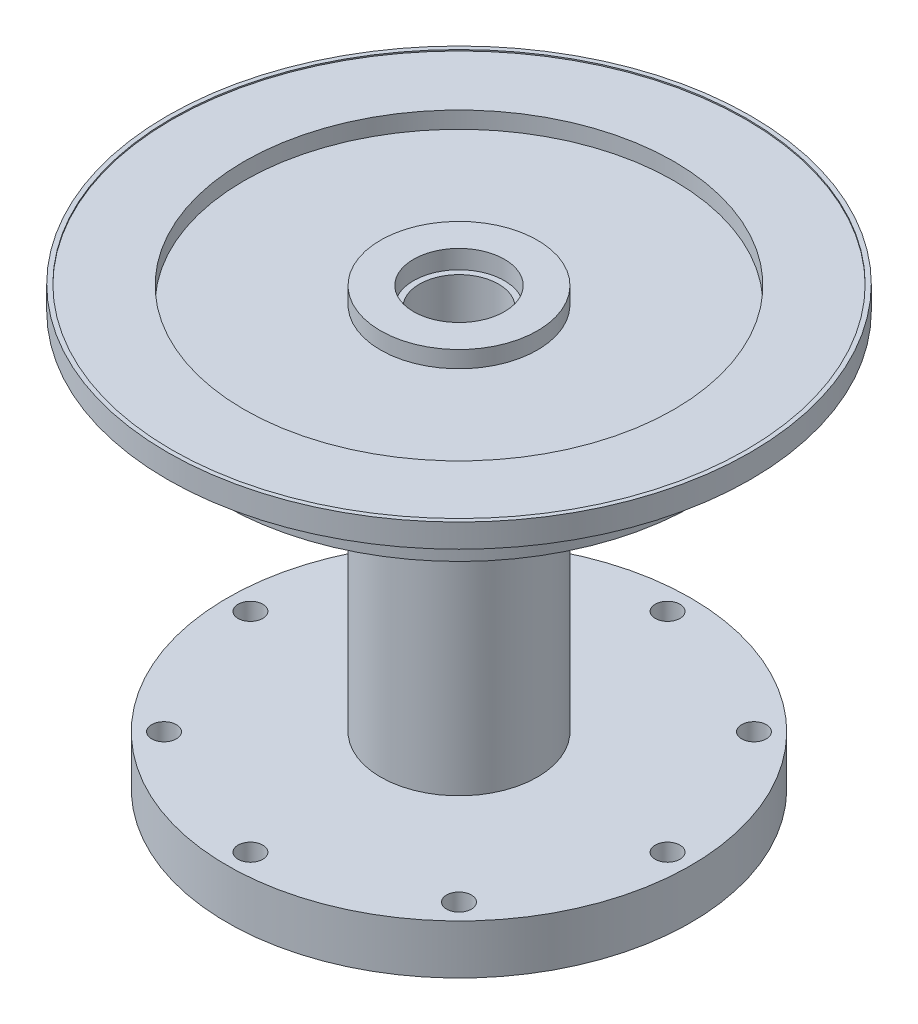
ISO-10303-21;
HEADER;
FILE_DESCRIPTION(('STEP AP214'),'2;1');
FILE_NAME('part.step','',(''),(''),'','','');
FILE_SCHEMA(('AUTOMOTIVE_DESIGN { 1 0 10303 214 1 1 1 1 }'));
ENDSEC;
DATA;
#1=APPLICATION_CONTEXT('core data for automotive mechanical design processes');
#2=APPLICATION_PROTOCOL_DEFINITION('international standard','automotive_design',2000,#1);
#3=PRODUCT_CONTEXT('',#1,'mechanical');
#4=PRODUCT('Part','Part','',(#3));
#5=PRODUCT_RELATED_PRODUCT_CATEGORY('part','',(#4));
#6=PRODUCT_DEFINITION_FORMATION('','',#4);
#7=PRODUCT_DEFINITION_CONTEXT('part definition',#1,'design');
#8=PRODUCT_DEFINITION('design','',#6,#7);
#9=PRODUCT_DEFINITION_SHAPE('','',#8);
#10=(LENGTH_UNIT() NAMED_UNIT(*) SI_UNIT(.MILLI.,.METRE.));
#11=(NAMED_UNIT(*) PLANE_ANGLE_UNIT() SI_UNIT($,.RADIAN.));
#12=(NAMED_UNIT(*) SI_UNIT($,.STERADIAN.) SOLID_ANGLE_UNIT());
#13=UNCERTAINTY_MEASURE_WITH_UNIT(LENGTH_MEASURE(1.E-05),#10,'distance_accuracy_value','');
#14=(GEOMETRIC_REPRESENTATION_CONTEXT(3) GLOBAL_UNCERTAINTY_ASSIGNED_CONTEXT((#13)) GLOBAL_UNIT_ASSIGNED_CONTEXT((#10,
#11,#12)) REPRESENTATION_CONTEXT('',''));
#15=CARTESIAN_POINT('',(0.,0.,0.));
#16=DIRECTION('',(0.,0.,1.));
#17=DIRECTION('',(1.,0.,0.));
#18=AXIS2_PLACEMENT_3D('',#15,#16,#17);
#19=CARTESIAN_POINT('',(0.,-58.8,0.));
#20=DIRECTION('',(0.,-1.,0.));
#21=DIRECTION('',(0.,0.,-1.));
#22=AXIS2_PLACEMENT_3D('',#19,#20,#21);
#23=PLANE('',#22);
#24=CARTESIAN_POINT('',(0.,-58.8,0.));
#25=DIRECTION('',(0.,-1.,0.));
#26=DIRECTION('',(0.,0.,-1.));
#27=AXIS2_PLACEMENT_3D('',#24,#25,#26);
#28=CIRCLE('',#27,5.35);
#29=CARTESIAN_POINT('',(0.,-58.8,-5.35));
#30=VERTEX_POINT('',#29);
#31=EDGE_CURVE('E141',#30,#30,#28,.T.);
#32=ORIENTED_EDGE('',*,*,#31,.F.);
#33=EDGE_LOOP('',(#32));
#34=FACE_BOUND('',#33,.T.);
#35=CARTESIAN_POINT('',(0.,-58.8,0.));
#36=DIRECTION('',(0.,-1.,0.));
#37=DIRECTION('',(0.,0.,-1.));
#38=AXIS2_PLACEMENT_3D('',#35,#36,#37);
#39=CIRCLE('',#38,19.21);
#40=CARTESIAN_POINT('',(0.,-58.8,-19.21));
#41=VERTEX_POINT('',#40);
#42=EDGE_CURVE('E151',#41,#41,#39,.T.);
#43=ORIENTED_EDGE('',*,*,#42,.T.);
#44=EDGE_LOOP('',(#43));
#45=FACE_BOUND('',#44,.T.);
#46=ADVANCED_FACE('F31',(#34,#45),#23,.T.);
#47=CARTESIAN_POINT('',(0.,0.,0.));
#48=DIRECTION('',(0.,1.,0.));
#49=DIRECTION('',(0.,0.,1.));
#50=AXIS2_PLACEMENT_3D('',#47,#48,#49);
#51=PLANE('',#50);
#52=CARTESIAN_POINT('',(0.,0.,0.));
#53=DIRECTION('',(0.,1.,0.));
#54=DIRECTION('',(0.,0.,1.));
#55=AXIS2_PLACEMENT_3D('',#52,#53,#54);
#56=CIRCLE('',#55,38.1);
#57=CARTESIAN_POINT('',(0.,0.,38.1));
#58=VERTEX_POINT('',#57);
#59=EDGE_CURVE('E43',#58,#58,#56,.T.);
#60=ORIENTED_EDGE('',*,*,#59,.F.);
#61=EDGE_LOOP('',(#60));
#62=FACE_BOUND('',#61,.T.);
#63=CARTESIAN_POINT('',(0.,0.,0.));
#64=DIRECTION('',(0.,1.,0.));
#65=DIRECTION('',(0.,0.,1.));
#66=AXIS2_PLACEMENT_3D('',#63,#64,#65);
#67=CIRCLE('',#66,12.7);
#68=CARTESIAN_POINT('',(0.,0.,12.7));
#69=VERTEX_POINT('',#68);
#70=EDGE_CURVE('E10',#69,#69,#67,.F.);
#71=ORIENTED_EDGE('',*,*,#70,.F.);
#72=EDGE_LOOP('',(#71));
#73=FACE_BOUND('',#72,.T.);
#74=ADVANCED_FACE('F228',(#62,#73),#51,.F.);
#75=CARTESIAN_POINT('',(0.,4.826,0.));
#76=DIRECTION('',(0.,-1.,0.));
#77=DIRECTION('',(0.,0.,-1.));
#78=AXIS2_PLACEMENT_3D('',#75,#76,#77);
#79=CYLINDRICAL_SURFACE('',#78,38.1);
#80=CARTESIAN_POINT('',(0.,4.826,0.));
#81=DIRECTION('',(0.,1.,0.));
#82=DIRECTION('',(0.,0.,1.));
#83=AXIS2_PLACEMENT_3D('',#80,#81,#82);
#84=CIRCLE('',#83,38.1);
#85=CARTESIAN_POINT('',(0.,4.826,38.1));
#86=VERTEX_POINT('',#85);
#87=EDGE_CURVE('E39',#86,#86,#84,.T.);
#88=ORIENTED_EDGE('',*,*,#87,.F.);
#89=EDGE_LOOP('',(#88));
#90=FACE_BOUND('',#89,.T.);
#91=ORIENTED_EDGE('',*,*,#59,.T.);
#92=EDGE_LOOP('',(#91));
#93=FACE_BOUND('',#92,.T.);
#94=ADVANCED_FACE('F33',(#90,#93),#79,.T.);
#95=CARTESIAN_POINT('',(0.,4.826,0.));
#96=DIRECTION('',(0.,1.,0.));
#97=DIRECTION('',(0.,0.,1.));
#98=AXIS2_PLACEMENT_3D('',#95,#96,#97);
#99=CONICAL_SURFACE('',#98,38.1,1.22173047639603);
#100=CARTESIAN_POINT('',(0.,8.128,0.));
#101=DIRECTION('',(0.,1.,0.));
#102=DIRECTION('',(0.,0.,1.));
#103=AXIS2_PLACEMENT_3D('',#100,#101,#102);
#104=CIRCLE('',#103,47.1721704390392);
#105=CARTESIAN_POINT('',(0.,8.128,-47.1721704390392));
#106=VERTEX_POINT('',#105);
#107=EDGE_CURVE('E47',#106,#106,#104,.T.);
#108=ORIENTED_EDGE('',*,*,#107,.F.);
#109=EDGE_LOOP('',(#108));
#110=FACE_BOUND('',#109,.T.);
#111=ORIENTED_EDGE('',*,*,#87,.T.);
#112=EDGE_LOOP('',(#111));
#113=FACE_BOUND('',#112,.T.);
#114=ADVANCED_FACE('F282',(#110,#113),#99,.T.);
#115=CARTESIAN_POINT('',(0.,11.938,0.));
#116=DIRECTION('',(0.,-1.,0.));
#117=DIRECTION('',(0.,0.,-1.));
#118=AXIS2_PLACEMENT_3D('',#115,#116,#117);
#119=CYLINDRICAL_SURFACE('',#118,47.1721704390392);
#120=CARTESIAN_POINT('',(0.,11.938,0.));
#121=DIRECTION('',(0.,1.,0.));
#122=DIRECTION('',(0.,0.,1.));
#123=AXIS2_PLACEMENT_3D('',#120,#121,#122);
#124=CIRCLE('',#123,47.1721704390392);
#125=CARTESIAN_POINT('',(0.,11.938,-47.1721704390392));
#126=VERTEX_POINT('',#125);
#127=EDGE_CURVE('E51',#126,#126,#124,.T.);
#128=CARTESIAN_POINT('',(0.,11.938,-47.1721704390392));
#129=CARTESIAN_POINT('',(0.,11.8983125,-47.1721704390392));
#130=CARTESIAN_POINT('',(0.,11.858625,-47.1721704390392));
#131=CARTESIAN_POINT('',(0.,11.77925,-47.1721704390392));
#132=CARTESIAN_POINT('',(0.,11.7395625,-47.1721704390392));
#133=CARTESIAN_POINT('',(0.,11.6601875,-47.1721704390392));
#134=CARTESIAN_POINT('',(0.,11.6205,-47.1721704390392));
#135=CARTESIAN_POINT('',(0.,11.541125,-47.1721704390392));
#136=CARTESIAN_POINT('',(0.,11.5014375,-47.1721704390392));
#137=CARTESIAN_POINT('',(0.,11.4220625,-47.1721704390392));
#138=CARTESIAN_POINT('',(0.,11.382375,-47.1721704390392));
#139=CARTESIAN_POINT('',(0.,11.303,-47.1721704390392));
#140=CARTESIAN_POINT('',(0.,11.2633125,-47.1721704390392));
#141=CARTESIAN_POINT('',(0.,11.1839375,-47.1721704390392));
#142=CARTESIAN_POINT('',(0.,11.14425,-47.1721704390392));
#143=CARTESIAN_POINT('',(0.,11.064875,-47.1721704390392));
#144=CARTESIAN_POINT('',(0.,11.0251875,-47.1721704390392));
#145=CARTESIAN_POINT('',(0.,10.9458125,-47.1721704390392));
#146=CARTESIAN_POINT('',(0.,10.906125,-47.1721704390392));
#147=CARTESIAN_POINT('',(0.,10.82675,-47.1721704390392));
#148=CARTESIAN_POINT('',(0.,10.7870625,-47.1721704390392));
#149=CARTESIAN_POINT('',(0.,10.7076875,-47.1721704390392));
#150=CARTESIAN_POINT('',(0.,10.668,-47.1721704390392));
#151=CARTESIAN_POINT('',(0.,10.588625,-47.1721704390392));
#152=CARTESIAN_POINT('',(0.,10.5489375,-47.1721704390392));
#153=CARTESIAN_POINT('',(0.,10.4695625,-47.1721704390392));
#154=CARTESIAN_POINT('',(0.,10.429875,-47.1721704390392));
#155=CARTESIAN_POINT('',(0.,10.3505,-47.1721704390392));
#156=CARTESIAN_POINT('',(0.,10.3108125,-47.1721704390392));
#157=CARTESIAN_POINT('',(0.,10.2314375,-47.1721704390392));
#158=CARTESIAN_POINT('',(0.,10.19175,-47.1721704390392));
#159=CARTESIAN_POINT('',(0.,10.112375,-47.1721704390392));
#160=CARTESIAN_POINT('',(0.,10.0726875,-47.1721704390392));
#161=CARTESIAN_POINT('',(0.,9.9933125,-47.1721704390392));
#162=CARTESIAN_POINT('',(0.,9.953625,-47.1721704390392));
#163=CARTESIAN_POINT('',(0.,9.87425,-47.1721704390392));
#164=CARTESIAN_POINT('',(0.,9.8345625,-47.1721704390392));
#165=CARTESIAN_POINT('',(0.,9.7551875,-47.1721704390392));
#166=CARTESIAN_POINT('',(0.,9.7155,-47.1721704390392));
#167=CARTESIAN_POINT('',(0.,9.636125,-47.1721704390392));
#168=CARTESIAN_POINT('',(0.,9.5964375,-47.1721704390392));
#169=CARTESIAN_POINT('',(0.,9.5170625,-47.1721704390392));
#170=CARTESIAN_POINT('',(0.,9.477375,-47.1721704390392));
#171=CARTESIAN_POINT('',(0.,9.398,-47.1721704390392));
#172=CARTESIAN_POINT('',(0.,9.3583125,-47.1721704390392));
#173=CARTESIAN_POINT('',(0.,9.2789375,-47.1721704390392));
#174=CARTESIAN_POINT('',(0.,9.23925,-47.1721704390392));
#175=CARTESIAN_POINT('',(0.,9.159875,-47.1721704390392));
#176=CARTESIAN_POINT('',(0.,9.1201875,-47.1721704390392));
#177=CARTESIAN_POINT('',(0.,9.0408125,-47.1721704390392));
#178=CARTESIAN_POINT('',(0.,9.001125,-47.1721704390392));
#179=CARTESIAN_POINT('',(0.,8.92175,-47.1721704390392));
#180=CARTESIAN_POINT('',(0.,8.8820625,-47.1721704390392));
#181=CARTESIAN_POINT('',(0.,8.8026875,-47.1721704390392));
#182=CARTESIAN_POINT('',(0.,8.763,-47.1721704390392));
#183=CARTESIAN_POINT('',(0.,8.683625,-47.1721704390392));
#184=CARTESIAN_POINT('',(0.,8.6439375,-47.1721704390392));
#185=CARTESIAN_POINT('',(0.,8.5645625,-47.1721704390392));
#186=CARTESIAN_POINT('',(0.,8.524875,-47.1721704390392));
#187=CARTESIAN_POINT('',(0.,8.4455,-47.1721704390392));
#188=CARTESIAN_POINT('',(0.,8.4058125,-47.1721704390392));
#189=CARTESIAN_POINT('',(0.,8.3264375,-47.1721704390392));
#190=CARTESIAN_POINT('',(0.,8.28675,-47.1721704390392));
#191=CARTESIAN_POINT('',(0.,8.207375,-47.1721704390392));
#192=CARTESIAN_POINT('',(0.,8.1676875,-47.1721704390392));
#193=CARTESIAN_POINT('',(0.,8.128,-47.1721704390392));
#194=B_SPLINE_CURVE_WITH_KNOTS('',3,(#128,#129,#130,#131,#132,#133,#134,#135,#136,#137,#138,
#139,#140,#141,#142,#143,#144,#145,#146,#147,#148,#149,#150,#151,#152,#153,#154,#155,#156,#157,
#158,#159,#160,#161,#162,#163,#164,#165,#166,#167,#168,#169,#170,#171,#172,#173,#174,#175,#176,
#177,#178,#179,#180,#181,#182,#183,#184,#185,#186,#187,#188,#189,#190,#191,#192,#193),
.UNSPECIFIED.,.F.,.F.,(4,2,2,2,2,2,2,2,2,2,2,2,2,2,2,2,2,2,2,2,2,2,2,2,2,2,2,2,2,2,2,2,4),(0.,
0.119062499999999,0.238124999999999,0.3571875,0.476249999999999,0.595312499999999,0.714375,
0.833437499999999,0.952499999999998,1.0715625,1.190625,1.3096875,1.42875,1.5478125,1.666875,
1.7859375,1.905,2.0240625,2.143125,2.2621875,2.38125,2.5003125,2.619375,2.7384375,2.8575,
2.9765625,3.095625,3.2146875,3.33375,3.4528125,3.571875,3.6909375,3.81),.UNSPECIFIED.);
#195=EDGE_CURVE('BSEAM278',#126,#106,#194,.T.);
#196=ORIENTED_EDGE('',*,*,#127,.F.);
#197=ORIENTED_EDGE('',*,*,#107,.T.);
#198=ORIENTED_EDGE('',*,*,#195,.T.);
#199=ORIENTED_EDGE('',*,*,#195,.F.);
#200=EDGE_LOOP('',(#196,#198,#197,#199));
#201=FACE_BOUND('',#200,.T.);
#202=ADVANCED_FACE('F278',(#201),#119,.T.);
#203=CARTESIAN_POINT('',(0.,11.938,0.));
#204=DIRECTION('',(0.,1.,0.));
#205=DIRECTION('',(0.,0.,1.));
#206=AXIS2_PLACEMENT_3D('',#203,#204,#205);
#207=PLANE('',#206);
#208=CARTESIAN_POINT('',(0.,11.938,0.));
#209=DIRECTION('',(0.,1.,0.));
#210=DIRECTION('',(0.,0.,1.));
#211=AXIS2_PLACEMENT_3D('',#208,#209,#210);
#212=CIRCLE('',#211,46.4721704390392);
#213=CARTESIAN_POINT('',(0.,11.938,46.4721704390392));
#214=VERTEX_POINT('',#213);
#215=EDGE_CURVE('E55',#214,#214,#212,.T.);
#216=ORIENTED_EDGE('',*,*,#215,.F.);
#217=EDGE_LOOP('',(#216));
#218=FACE_BOUND('',#217,.T.);
#219=ORIENTED_EDGE('',*,*,#127,.T.);
#220=EDGE_LOOP('',(#219));
#221=FACE_BOUND('',#220,.T.);
#222=ADVANCED_FACE('F274',(#218,#221),#207,.T.);
#223=CARTESIAN_POINT('',(0.,11.738,0.));
#224=DIRECTION('',(0.,1.,0.));
#225=DIRECTION('',(0.,0.,1.));
#226=AXIS2_PLACEMENT_3D('',#223,#224,#225);
#227=CYLINDRICAL_SURFACE('',#226,46.4721704390392);
#228=CARTESIAN_POINT('',(0.,11.738,0.));
#229=DIRECTION('',(0.,1.,0.));
#230=DIRECTION('',(0.,0.,1.));
#231=AXIS2_PLACEMENT_3D('',#228,#229,#230);
#232=CIRCLE('',#231,46.4721704390392);
#233=CARTESIAN_POINT('',(0.,11.738,46.4721704390392));
#234=VERTEX_POINT('',#233);
#235=EDGE_CURVE('E54',#234,#234,#232,.T.);
#236=ORIENTED_EDGE('',*,*,#235,.F.);
#237=EDGE_LOOP('',(#236));
#238=FACE_BOUND('',#237,.T.);
#239=ORIENTED_EDGE('',*,*,#215,.T.);
#240=EDGE_LOOP('',(#239));
#241=FACE_BOUND('',#240,.T.);
#242=ADVANCED_FACE('F270',(#238,#241),#227,.F.);
#243=CARTESIAN_POINT('',(0.,11.738,0.));
#244=DIRECTION('',(0.,1.,0.));
#245=DIRECTION('',(0.,0.,1.));
#246=AXIS2_PLACEMENT_3D('',#243,#244,#245);
#247=PLANE('',#246);
#248=CARTESIAN_POINT('',(0.,11.738,0.));
#249=DIRECTION('',(0.,1.,0.));
#250=DIRECTION('',(0.,0.,1.));
#251=AXIS2_PLACEMENT_3D('',#248,#249,#250);
#252=CIRCLE('',#251,34.7721704390392);
#253=CARTESIAN_POINT('',(0.,11.738,34.7721704390392));
#254=VERTEX_POINT('',#253);
#255=EDGE_CURVE('E61',#254,#254,#252,.T.);
#256=ORIENTED_EDGE('',*,*,#255,.F.);
#257=EDGE_LOOP('',(#256));
#258=FACE_BOUND('',#257,.T.);
#259=ORIENTED_EDGE('',*,*,#235,.T.);
#260=EDGE_LOOP('',(#259));
#261=FACE_BOUND('',#260,.T.);
#262=ADVANCED_FACE('F225',(#258,#261),#247,.T.);
#263=CARTESIAN_POINT('',(0.,9.038,0.));
#264=DIRECTION('',(0.,1.,0.));
#265=DIRECTION('',(0.,0.,1.));
#266=AXIS2_PLACEMENT_3D('',#263,#264,#265);
#267=CYLINDRICAL_SURFACE('',#266,34.7721704390392);
#268=CARTESIAN_POINT('',(0.,9.038,0.));
#269=DIRECTION('',(0.,1.,0.));
#270=DIRECTION('',(0.,0.,1.));
#271=AXIS2_PLACEMENT_3D('',#268,#269,#270);
#272=CIRCLE('',#271,34.7721704390392);
#273=CARTESIAN_POINT('',(0.,9.038,34.7721704390392));
#274=VERTEX_POINT('',#273);
#275=EDGE_CURVE('E58',#274,#274,#272,.T.);
#276=CARTESIAN_POINT('',(0.,9.038,34.7721704390392));
#277=CARTESIAN_POINT('',(0.,9.066125,34.7721704390392));
#278=CARTESIAN_POINT('',(0.,9.09425,34.7721704390392));
#279=CARTESIAN_POINT('',(0.,9.1505,34.7721704390392));
#280=CARTESIAN_POINT('',(0.,9.178625,34.7721704390392));
#281=CARTESIAN_POINT('',(0.,9.234875,34.7721704390392));
#282=CARTESIAN_POINT('',(0.,9.263,34.7721704390392));
#283=CARTESIAN_POINT('',(0.,9.31925,34.7721704390392));
#284=CARTESIAN_POINT('',(0.,9.347375,34.7721704390392));
#285=CARTESIAN_POINT('',(0.,9.403625,34.7721704390392));
#286=CARTESIAN_POINT('',(0.,9.43175,34.7721704390392));
#287=CARTESIAN_POINT('',(0.,9.488,34.7721704390392));
#288=CARTESIAN_POINT('',(0.,9.516125,34.7721704390392));
#289=CARTESIAN_POINT('',(0.,9.572375,34.7721704390392));
#290=CARTESIAN_POINT('',(0.,9.6005,34.7721704390392));
#291=CARTESIAN_POINT('',(0.,9.65675,34.7721704390392));
#292=CARTESIAN_POINT('',(0.,9.684875,34.7721704390392));
#293=CARTESIAN_POINT('',(0.,9.741125,34.7721704390392));
#294=CARTESIAN_POINT('',(0.,9.76925,34.7721704390392));
#295=CARTESIAN_POINT('',(0.,9.8255,34.7721704390392));
#296=CARTESIAN_POINT('',(0.,9.853625,34.7721704390392));
#297=CARTESIAN_POINT('',(0.,9.909875,34.7721704390392));
#298=CARTESIAN_POINT('',(0.,9.938,34.7721704390392));
#299=CARTESIAN_POINT('',(0.,9.99425,34.7721704390392));
#300=CARTESIAN_POINT('',(0.,10.022375,34.7721704390392));
#301=CARTESIAN_POINT('',(0.,10.078625,34.7721704390392));
#302=CARTESIAN_POINT('',(0.,10.10675,34.7721704390392));
#303=CARTESIAN_POINT('',(0.,10.163,34.7721704390392));
#304=CARTESIAN_POINT('',(0.,10.191125,34.7721704390392));
#305=CARTESIAN_POINT('',(0.,10.247375,34.7721704390392));
#306=CARTESIAN_POINT('',(0.,10.2755,34.7721704390392));
#307=CARTESIAN_POINT('',(0.,10.33175,34.7721704390392));
#308=CARTESIAN_POINT('',(0.,10.359875,34.7721704390392));
#309=CARTESIAN_POINT('',(0.,10.416125,34.7721704390392));
#310=CARTESIAN_POINT('',(0.,10.44425,34.7721704390392));
#311=CARTESIAN_POINT('',(0.,10.5005,34.7721704390392));
#312=CARTESIAN_POINT('',(0.,10.528625,34.7721704390392));
#313=CARTESIAN_POINT('',(0.,10.584875,34.7721704390392));
#314=CARTESIAN_POINT('',(0.,10.613,34.7721704390392));
#315=CARTESIAN_POINT('',(0.,10.66925,34.7721704390392));
#316=CARTESIAN_POINT('',(0.,10.697375,34.7721704390392));
#317=CARTESIAN_POINT('',(0.,10.753625,34.7721704390392));
#318=CARTESIAN_POINT('',(0.,10.78175,34.7721704390392));
#319=CARTESIAN_POINT('',(0.,10.838,34.7721704390392));
#320=CARTESIAN_POINT('',(0.,10.866125,34.7721704390392));
#321=CARTESIAN_POINT('',(0.,10.922375,34.7721704390392));
#322=CARTESIAN_POINT('',(0.,10.9505,34.7721704390392));
#323=CARTESIAN_POINT('',(0.,11.00675,34.7721704390392));
#324=CARTESIAN_POINT('',(0.,11.034875,34.7721704390392));
#325=CARTESIAN_POINT('',(0.,11.091125,34.7721704390392));
#326=CARTESIAN_POINT('',(0.,11.11925,34.7721704390392));
#327=CARTESIAN_POINT('',(0.,11.1755,34.7721704390392));
#328=CARTESIAN_POINT('',(0.,11.203625,34.7721704390392));
#329=CARTESIAN_POINT('',(0.,11.259875,34.7721704390392));
#330=CARTESIAN_POINT('',(0.,11.288,34.7721704390392));
#331=CARTESIAN_POINT('',(0.,11.34425,34.7721704390392));
#332=CARTESIAN_POINT('',(0.,11.372375,34.7721704390392));
#333=CARTESIAN_POINT('',(0.,11.428625,34.7721704390392));
#334=CARTESIAN_POINT('',(0.,11.45675,34.7721704390392));
#335=CARTESIAN_POINT('',(0.,11.513,34.7721704390392));
#336=CARTESIAN_POINT('',(0.,11.541125,34.7721704390392));
#337=CARTESIAN_POINT('',(0.,11.597375,34.7721704390392));
#338=CARTESIAN_POINT('',(0.,11.6255,34.7721704390392));
#339=CARTESIAN_POINT('',(0.,11.68175,34.7721704390392));
#340=CARTESIAN_POINT('',(0.,11.709875,34.7721704390392));
#341=CARTESIAN_POINT('',(0.,11.738,34.7721704390392));
#342=B_SPLINE_CURVE_WITH_KNOTS('',3,(#276,#277,#278,#279,#280,#281,#282,#283,#284,#285,#286,
#287,#288,#289,#290,#291,#292,#293,#294,#295,#296,#297,#298,#299,#300,#301,#302,#303,#304,#305,
#306,#307,#308,#309,#310,#311,#312,#313,#314,#315,#316,#317,#318,#319,#320,#321,#322,#323,#324,
#325,#326,#327,#328,#329,#330,#331,#332,#333,#334,#335,#336,#337,#338,#339,#340,#341),
.UNSPECIFIED.,.F.,.F.,(4,2,2,2,2,2,2,2,2,2,2,2,2,2,2,2,2,2,2,2,2,2,2,2,2,2,2,2,2,2,2,2,4),(0.,
0.0843749999999994,0.168749999999999,0.253125,0.337499999999999,0.421874999999999,0.50625,
0.590624999999999,0.674999999999998,0.759375,0.843749999999999,0.928125,1.0125,1.096875,1.18125,
1.265625,1.35,1.434375,1.51875,1.603125,1.6875,1.771875,1.85625,1.940625,2.025,2.109375,2.19375,
2.278125,2.3625,2.446875,2.53125,2.615625,2.7),.UNSPECIFIED.);
#343=EDGE_CURVE('BSEAM262',#274,#254,#342,.T.);
#344=ORIENTED_EDGE('',*,*,#275,.F.);
#345=ORIENTED_EDGE('',*,*,#255,.T.);
#346=ORIENTED_EDGE('',*,*,#343,.T.);
#347=ORIENTED_EDGE('',*,*,#343,.F.);
#348=EDGE_LOOP('',(#344,#346,#345,#347));
#349=FACE_BOUND('',#348,.T.);
#350=ADVANCED_FACE('F262',(#349),#267,.F.);
#351=CARTESIAN_POINT('',(0.,9.038,0.));
#352=DIRECTION('',(0.,1.,0.));
#353=DIRECTION('',(0.,0.,1.));
#354=AXIS2_PLACEMENT_3D('',#351,#352,#353);
#355=PLANE('',#354);
#356=CARTESIAN_POINT('',(0.,9.038,0.));
#357=DIRECTION('',(0.,1.,0.));
#358=DIRECTION('',(0.,0.,1.));
#359=AXIS2_PLACEMENT_3D('',#356,#357,#358);
#360=CIRCLE('',#359,12.7);
#361=CARTESIAN_POINT('',(0.,9.03799999999999,12.7));
#362=VERTEX_POINT('',#361);
#363=EDGE_CURVE('E64',#362,#362,#360,.T.);
#364=ORIENTED_EDGE('',*,*,#363,.F.);
#365=EDGE_LOOP('',(#364));
#366=FACE_BOUND('',#365,.T.);
#367=ORIENTED_EDGE('',*,*,#275,.T.);
#368=EDGE_LOOP('',(#367));
#369=FACE_BOUND('',#368,.T.);
#370=ADVANCED_FACE('F257',(#366,#369),#355,.T.);
#371=CARTESIAN_POINT('',(0.,9.038,0.));
#372=DIRECTION('',(0.,1.,0.));
#373=DIRECTION('',(0.,0.,1.));
#374=AXIS2_PLACEMENT_3D('',#371,#372,#373);
#375=CYLINDRICAL_SURFACE('',#374,12.7);
#376=CARTESIAN_POINT('',(0.,11.738,0.));
#377=DIRECTION('',(0.,1.,0.));
#378=DIRECTION('',(0.,0.,1.));
#379=AXIS2_PLACEMENT_3D('',#376,#377,#378);
#380=CIRCLE('',#379,12.7);
#381=CARTESIAN_POINT('',(0.,11.738,12.7));
#382=VERTEX_POINT('',#381);
#383=EDGE_CURVE('E67',#382,#382,#380,.T.);
#384=CARTESIAN_POINT('',(0.,9.03799999999999,12.7));
#385=CARTESIAN_POINT('',(0.,9.066125,12.7));
#386=CARTESIAN_POINT('',(0.,9.09425,12.7));
#387=CARTESIAN_POINT('',(0.,9.1505,12.7));
#388=CARTESIAN_POINT('',(0.,9.178625,12.7));
#389=CARTESIAN_POINT('',(0.,9.234875,12.7));
#390=CARTESIAN_POINT('',(0.,9.263,12.7));
#391=CARTESIAN_POINT('',(0.,9.31925,12.7));
#392=CARTESIAN_POINT('',(0.,9.347375,12.7));
#393=CARTESIAN_POINT('',(0.,9.403625,12.7));
#394=CARTESIAN_POINT('',(0.,9.43175,12.7));
#395=CARTESIAN_POINT('',(0.,9.488,12.7));
#396=CARTESIAN_POINT('',(0.,9.516125,12.7));
#397=CARTESIAN_POINT('',(0.,9.572375,12.7));
#398=CARTESIAN_POINT('',(0.,9.6005,12.7));
#399=CARTESIAN_POINT('',(0.,9.65675,12.7));
#400=CARTESIAN_POINT('',(0.,9.684875,12.7));
#401=CARTESIAN_POINT('',(0.,9.741125,12.7));
#402=CARTESIAN_POINT('',(0.,9.76925,12.7));
#403=CARTESIAN_POINT('',(0.,9.8255,12.7));
#404=CARTESIAN_POINT('',(0.,9.853625,12.7));
#405=CARTESIAN_POINT('',(0.,9.909875,12.7));
#406=CARTESIAN_POINT('',(0.,9.938,12.7));
#407=CARTESIAN_POINT('',(0.,9.99425,12.7));
#408=CARTESIAN_POINT('',(0.,10.022375,12.7));
#409=CARTESIAN_POINT('',(0.,10.078625,12.7));
#410=CARTESIAN_POINT('',(0.,10.10675,12.7));
#411=CARTESIAN_POINT('',(0.,10.163,12.7));
#412=CARTESIAN_POINT('',(0.,10.191125,12.7));
#413=CARTESIAN_POINT('',(0.,10.247375,12.7));
#414=CARTESIAN_POINT('',(0.,10.2755,12.7));
#415=CARTESIAN_POINT('',(0.,10.33175,12.7));
#416=CARTESIAN_POINT('',(0.,10.359875,12.7));
#417=CARTESIAN_POINT('',(0.,10.416125,12.7));
#418=CARTESIAN_POINT('',(0.,10.44425,12.7));
#419=CARTESIAN_POINT('',(0.,10.5005,12.7));
#420=CARTESIAN_POINT('',(0.,10.528625,12.7));
#421=CARTESIAN_POINT('',(0.,10.584875,12.7));
#422=CARTESIAN_POINT('',(0.,10.613,12.7));
#423=CARTESIAN_POINT('',(0.,10.66925,12.7));
#424=CARTESIAN_POINT('',(0.,10.697375,12.7));
#425=CARTESIAN_POINT('',(0.,10.753625,12.7));
#426=CARTESIAN_POINT('',(0.,10.78175,12.7));
#427=CARTESIAN_POINT('',(0.,10.838,12.7));
#428=CARTESIAN_POINT('',(0.,10.866125,12.7));
#429=CARTESIAN_POINT('',(0.,10.922375,12.7));
#430=CARTESIAN_POINT('',(0.,10.9505,12.7));
#431=CARTESIAN_POINT('',(0.,11.00675,12.7));
#432=CARTESIAN_POINT('',(0.,11.034875,12.7));
#433=CARTESIAN_POINT('',(0.,11.091125,12.7));
#434=CARTESIAN_POINT('',(0.,11.11925,12.7));
#435=CARTESIAN_POINT('',(0.,11.1755,12.7));
#436=CARTESIAN_POINT('',(0.,11.203625,12.7));
#437=CARTESIAN_POINT('',(0.,11.259875,12.7));
#438=CARTESIAN_POINT('',(0.,11.288,12.7));
#439=CARTESIAN_POINT('',(0.,11.34425,12.7));
#440=CARTESIAN_POINT('',(0.,11.372375,12.7));
#441=CARTESIAN_POINT('',(0.,11.428625,12.7));
#442=CARTESIAN_POINT('',(0.,11.45675,12.7));
#443=CARTESIAN_POINT('',(0.,11.513,12.7));
#444=CARTESIAN_POINT('',(0.,11.541125,12.7));
#445=CARTESIAN_POINT('',(0.,11.597375,12.7));
#446=CARTESIAN_POINT('',(0.,11.6255,12.7));
#447=CARTESIAN_POINT('',(0.,11.68175,12.7));
#448=CARTESIAN_POINT('',(0.,11.709875,12.7));
#449=CARTESIAN_POINT('',(0.,11.738,12.7));
#450=B_SPLINE_CURVE_WITH_KNOTS('',3,(#384,#385,#386,#387,#388,#389,#390,#391,#392,#393,#394,
#395,#396,#397,#398,#399,#400,#401,#402,#403,#404,#405,#406,#407,#408,#409,#410,#411,#412,#413,
#414,#415,#416,#417,#418,#419,#420,#421,#422,#423,#424,#425,#426,#427,#428,#429,#430,#431,#432,
#433,#434,#435,#436,#437,#438,#439,#440,#441,#442,#443,#444,#445,#446,#447,#448,#449),
.UNSPECIFIED.,.F.,.F.,(4,2,2,2,2,2,2,2,2,2,2,2,2,2,2,2,2,2,2,2,2,2,2,2,2,2,2,2,2,2,2,2,4),(0.,
0.0843750000000011,0.168750000000001,0.253125000000002,0.337500000000001,0.421875,
0.506250000000002,0.590625000000001,0.675,0.759375000000001,0.843750000000001,0.928125000000002,
1.0125,1.096875,1.18125,1.265625,1.35,1.434375,1.51875,1.603125,1.6875,1.771875,1.85625,
1.940625,2.025,2.109375,2.19375,2.278125,2.3625,2.446875,2.53125,2.615625,2.7),.UNSPECIFIED.);
#451=EDGE_CURVE('BSEAM222',#362,#382,#450,.T.);
#452=ORIENTED_EDGE('',*,*,#363,.T.);
#453=ORIENTED_EDGE('',*,*,#383,.F.);
#454=ORIENTED_EDGE('',*,*,#451,.T.);
#455=ORIENTED_EDGE('',*,*,#451,.F.);
#456=EDGE_LOOP('',(#452,#454,#453,#455));
#457=FACE_BOUND('',#456,.T.);
#458=ADVANCED_FACE('F222',(#457),#375,.T.);
#459=CARTESIAN_POINT('',(0.,11.738,0.));
#460=DIRECTION('',(0.,1.,0.));
#461=DIRECTION('',(0.,0.,1.));
#462=AXIS2_PLACEMENT_3D('',#459,#460,#461);
#463=CIRCLE('',#462,7.35);
#464=CARTESIAN_POINT('',(0.,11.738,7.35));
#465=VERTEX_POINT('',#464);
#466=EDGE_CURVE('E76',#465,#465,#463,.T.);
#467=ORIENTED_EDGE('',*,*,#466,.F.);
#468=EDGE_LOOP('',(#467));
#469=FACE_BOUND('',#468,.T.);
#470=ORIENTED_EDGE('',*,*,#383,.T.);
#471=EDGE_LOOP('',(#470));
#472=FACE_BOUND('',#471,.T.);
#473=ADVANCED_FACE('F213',(#469,#472),#247,.T.);
#474=CARTESIAN_POINT('',(0.,-50.8,0.));
#475=DIRECTION('',(0.,1.,0.));
#476=DIRECTION('',(0.,0.,1.));
#477=AXIS2_PLACEMENT_3D('',#474,#475,#476);
#478=CYLINDRICAL_SURFACE('',#477,12.7);
#479=CARTESIAN_POINT('',(0.,-50.8,0.));
#480=DIRECTION('',(0.,-1.,0.));
#481=DIRECTION('',(0.,0.,-1.));
#482=AXIS2_PLACEMENT_3D('',#479,#480,#481);
#483=CIRCLE('',#482,12.7);
#484=CARTESIAN_POINT('',(0.,-50.8,-12.7));
#485=VERTEX_POINT('',#484);
#486=EDGE_CURVE('E70',#485,#485,#483,.T.);
#487=ORIENTED_EDGE('',*,*,#486,.F.);
#488=EDGE_LOOP('',(#487));
#489=FACE_BOUND('',#488,.T.);
#490=ORIENTED_EDGE('',*,*,#70,.T.);
#491=EDGE_LOOP('',(#490));
#492=FACE_BOUND('',#491,.T.);
#493=ADVANCED_FACE('F210',(#489,#492),#478,.T.);
#494=CARTESIAN_POINT('',(0.,8.738,0.));
#495=DIRECTION('',(0.,1.,0.));
#496=DIRECTION('',(0.,0.,1.));
#497=AXIS2_PLACEMENT_3D('',#494,#495,#496);
#498=CYLINDRICAL_SURFACE('',#497,7.35);
#499=CARTESIAN_POINT('',(0.,8.738,0.));
#500=DIRECTION('',(0.,1.,0.));
#501=DIRECTION('',(0.,0.,1.));
#502=AXIS2_PLACEMENT_3D('',#499,#500,#501);
#503=CIRCLE('',#502,7.35);
#504=CARTESIAN_POINT('',(0.,8.738,7.35));
#505=VERTEX_POINT('',#504);
#506=EDGE_CURVE('E75',#505,#505,#503,.T.);
#507=ORIENTED_EDGE('',*,*,#506,.F.);
#508=EDGE_LOOP('',(#507));
#509=FACE_BOUND('',#508,.T.);
#510=ORIENTED_EDGE('',*,*,#466,.T.);
#511=EDGE_LOOP('',(#510));
#512=FACE_BOUND('',#511,.T.);
#513=ADVANCED_FACE('F212',(#509,#512),#498,.F.);
#514=CARTESIAN_POINT('',(0.,8.738,0.));
#515=DIRECTION('',(0.,1.,0.));
#516=DIRECTION('',(0.,0.,1.));
#517=AXIS2_PLACEMENT_3D('',#514,#515,#516);
#518=PLANE('',#517);
#519=CARTESIAN_POINT('',(0.,8.738,0.));
#520=DIRECTION('',(0.,1.,0.));
#521=DIRECTION('',(0.,0.,1.));
#522=AXIS2_PLACEMENT_3D('',#519,#520,#521);
#523=CIRCLE('',#522,6.4);
#524=CARTESIAN_POINT('',(0.,8.738,6.4));
#525=VERTEX_POINT('',#524);
#526=EDGE_CURVE('E35',#525,#525,#523,.T.);
#527=ORIENTED_EDGE('',*,*,#526,.F.);
#528=EDGE_LOOP('',(#527));
#529=FACE_BOUND('',#528,.T.);
#530=ORIENTED_EDGE('',*,*,#506,.T.);
#531=EDGE_LOOP('',(#530));
#532=FACE_BOUND('',#531,.T.);
#533=ADVANCED_FACE('F219',(#529,#532),#518,.T.);
#534=CARTESIAN_POINT('',(0.,11.938,0.));
#535=DIRECTION('',(0.,-1.,0.));
#536=DIRECTION('',(0.,0.,-1.));
#537=AXIS2_PLACEMENT_3D('',#534,#535,#536);
#538=CYLINDRICAL_SURFACE('',#537,6.4);
#539=ORIENTED_EDGE('',*,*,#526,.T.);
#540=EDGE_LOOP('',(#539));
#541=FACE_BOUND('',#540,.T.);
#542=CARTESIAN_POINT('',(0.,-50.8,0.));
#543=DIRECTION('',(0.,-1.,0.));
#544=DIRECTION('',(0.,0.,-1.));
#545=AXIS2_PLACEMENT_3D('',#542,#543,#544);
#546=CIRCLE('',#545,6.4);
#547=CARTESIAN_POINT('',(0.,-50.8,-6.4));
#548=VERTEX_POINT('',#547);
#549=EDGE_CURVE('E81',#548,#548,#546,.F.);
#550=ORIENTED_EDGE('',*,*,#549,.F.);
#551=EDGE_LOOP('',(#550));
#552=FACE_BOUND('',#551,.T.);
#553=ADVANCED_FACE('F239',(#541,#552),#538,.F.);
#554=CARTESIAN_POINT('',(0.,-50.8,0.));
#555=DIRECTION('',(0.,-1.,0.));
#556=DIRECTION('',(0.,0.,-1.));
#557=AXIS2_PLACEMENT_3D('',#554,#555,#556);
#558=PLANE('',#557);
#559=CARTESIAN_POINT('',(0.,-50.8,0.));
#560=DIRECTION('',(0.,-1.,0.));
#561=DIRECTION('',(0.,0.,-1.));
#562=AXIS2_PLACEMENT_3D('',#559,#560,#561);
#563=CIRCLE('',#562,5.35);
#564=CARTESIAN_POINT('',(0.,-50.8,-5.35));
#565=VERTEX_POINT('',#564);
#566=EDGE_CURVE('E138',#565,#565,#563,.F.);
#567=ORIENTED_EDGE('',*,*,#566,.F.);
#568=EDGE_LOOP('',(#567));
#569=FACE_BOUND('',#568,.T.);
#570=ORIENTED_EDGE('',*,*,#549,.T.);
#571=EDGE_LOOP('',(#570));
#572=FACE_BOUND('',#571,.T.);
#573=ADVANCED_FACE('F205',(#569,#572),#558,.F.);
#574=CARTESIAN_POINT('',(-23.8648538650463,-50.8,23.8648538650457));
#575=DIRECTION('',(0.,-1.,0.));
#576=DIRECTION('',(0.,0.,-1.));
#577=AXIS2_PLACEMENT_3D('',#574,#575,#576);
#578=CIRCLE('',#577,2.);
#579=CARTESIAN_POINT('',(-23.8648538650463,-50.8,21.8648538650457));
#580=VERTEX_POINT('',#579);
#581=EDGE_CURVE('E132',#580,#580,#578,.F.);
#582=ORIENTED_EDGE('',*,*,#581,.F.);
#583=EDGE_LOOP('',(#582));
#584=FACE_BOUND('',#583,.T.);
#585=CARTESIAN_POINT('',(-33.75,-50.8,0.));
#586=DIRECTION('',(0.,-1.,0.));
#587=DIRECTION('',(0.,0.,-1.));
#588=AXIS2_PLACEMENT_3D('',#585,#586,#587);
#589=CIRCLE('',#588,2.);
#590=CARTESIAN_POINT('',(-33.75,-50.8,-2.));
#591=VERTEX_POINT('',#590);
#592=EDGE_CURVE('E126',#591,#591,#589,.F.);
#593=ORIENTED_EDGE('',*,*,#592,.F.);
#594=EDGE_LOOP('',(#593));
#595=FACE_BOUND('',#594,.T.);
#596=CARTESIAN_POINT('',(-23.8648538650455,-50.8,-23.8648538650465));
#597=DIRECTION('',(0.,-1.,0.));
#598=DIRECTION('',(0.,0.,-1.));
#599=AXIS2_PLACEMENT_3D('',#596,#597,#598);
#600=CIRCLE('',#599,2.);
#601=CARTESIAN_POINT('',(-23.8648538650455,-50.8,-25.8648538650465));
#602=VERTEX_POINT('',#601);
#603=EDGE_CURVE('E120',#602,#602,#600,.F.);
#604=ORIENTED_EDGE('',*,*,#603,.F.);
#605=EDGE_LOOP('',(#604));
#606=FACE_BOUND('',#605,.T.);
#607=CARTESIAN_POINT('',(7.23379689482329E-13,-50.8,-33.7500000000001));
#608=DIRECTION('',(0.,-1.,0.));
#609=DIRECTION('',(0.,0.,-1.));
#610=AXIS2_PLACEMENT_3D('',#607,#608,#609);
#611=CIRCLE('',#610,2.00000000000001);
#612=CARTESIAN_POINT('',(7.23379689482329E-13,-50.8,-35.7500000000001));
#613=VERTEX_POINT('',#612);
#614=EDGE_CURVE('E114',#613,#613,#611,.F.);
#615=ORIENTED_EDGE('',*,*,#614,.F.);
#616=EDGE_LOOP('',(#615));
#617=FACE_BOUND('',#616,.T.);
#618=CARTESIAN_POINT('',(23.8648538650466,-50.8,-23.8648538650456));
#619=DIRECTION('',(0.,-1.,0.));
#620=DIRECTION('',(0.,0.,-1.));
#621=AXIS2_PLACEMENT_3D('',#618,#619,#620);
#622=CIRCLE('',#621,2.00000000000001);
#623=CARTESIAN_POINT('',(23.8648538650466,-50.8,-25.8648538650457));
#624=VERTEX_POINT('',#623);
#625=EDGE_CURVE('E108',#624,#624,#622,.F.);
#626=ORIENTED_EDGE('',*,*,#625,.F.);
#627=EDGE_LOOP('',(#626));
#628=FACE_BOUND('',#627,.T.);
#629=CARTESIAN_POINT('',(33.7500000000002,-50.8,1.85615411929518E-13));
#630=DIRECTION('',(0.,-1.,0.));
#631=DIRECTION('',(0.,0.,-1.));
#632=AXIS2_PLACEMENT_3D('',#629,#630,#631);
#633=CIRCLE('',#632,2.00000000000001);
#634=CARTESIAN_POINT('',(33.7500000000002,-50.8,-1.99999999999982));
#635=VERTEX_POINT('',#634);
#636=EDGE_CURVE('E102',#635,#635,#633,.F.);
#637=ORIENTED_EDGE('',*,*,#636,.F.);
#638=EDGE_LOOP('',(#637));
#639=FACE_BOUND('',#638,.T.);
#640=CARTESIAN_POINT('',(23.8648538650459,-50.8,23.8648538650462));
#641=DIRECTION('',(0.,-1.,0.));
#642=DIRECTION('',(0.,0.,-1.));
#643=AXIS2_PLACEMENT_3D('',#640,#641,#642);
#644=CIRCLE('',#643,2.00000000000001);
#645=CARTESIAN_POINT('',(23.8648538650459,-50.8,21.8648538650462));
#646=VERTEX_POINT('',#645);
#647=EDGE_CURVE('E96',#646,#646,#644,.F.);
#648=ORIENTED_EDGE('',*,*,#647,.F.);
#649=EDGE_LOOP('',(#648));
#650=FACE_BOUND('',#649,.T.);
#651=CARTESIAN_POINT('',(-3.48471251854221E-13,-50.8,33.75));
#652=DIRECTION('',(0.,-1.,0.));
#653=DIRECTION('',(0.,0.,-1.));
#654=AXIS2_PLACEMENT_3D('',#651,#652,#653);
#655=CIRCLE('',#654,2.);
#656=CARTESIAN_POINT('',(-3.48471251854221E-13,-50.8,31.75));
#657=VERTEX_POINT('',#656);
#658=EDGE_CURVE('E88',#657,#657,#655,.F.);
#659=ORIENTED_EDGE('',*,*,#658,.F.);
#660=EDGE_LOOP('',(#659));
#661=FACE_BOUND('',#660,.T.);
#662=CARTESIAN_POINT('',(0.,-50.8,0.));
#663=DIRECTION('',(0.,-1.,0.));
#664=DIRECTION('',(0.,0.,-1.));
#665=AXIS2_PLACEMENT_3D('',#662,#663,#664);
#666=CIRCLE('',#665,37.5);
#667=CARTESIAN_POINT('',(0.,-50.8,-37.5));
#668=VERTEX_POINT('',#667);
#669=EDGE_CURVE('E85',#668,#668,#666,.T.);
#670=ORIENTED_EDGE('',*,*,#669,.F.);
#671=EDGE_LOOP('',(#670));
#672=FACE_BOUND('',#671,.T.);
#673=ORIENTED_EDGE('',*,*,#486,.T.);
#674=EDGE_LOOP('',(#673));
#675=FACE_BOUND('',#674,.T.);
#676=ADVANCED_FACE('F199',(#584,#595,#606,#617,#628,#639,#650,#661,#672,#675),#558,.F.);
#677=CARTESIAN_POINT('',(0.,-58.8,0.));
#678=DIRECTION('',(0.,1.,0.));
#679=DIRECTION('',(0.,0.,1.));
#680=AXIS2_PLACEMENT_3D('',#677,#678,#679);
#681=CYLINDRICAL_SURFACE('',#680,37.5);
#682=CARTESIAN_POINT('',(0.,-58.8,0.));
#683=DIRECTION('',(0.,-1.,0.));
#684=DIRECTION('',(0.,0.,-1.));
#685=AXIS2_PLACEMENT_3D('',#682,#683,#684);
#686=CIRCLE('',#685,37.5);
#687=CARTESIAN_POINT('',(0.,-58.8,-37.5));
#688=VERTEX_POINT('',#687);
#689=EDGE_CURVE('E84',#688,#688,#686,.T.);
#690=ORIENTED_EDGE('',*,*,#689,.F.);
#691=EDGE_LOOP('',(#690));
#692=FACE_BOUND('',#691,.T.);
#693=ORIENTED_EDGE('',*,*,#669,.T.);
#694=EDGE_LOOP('',(#693));
#695=FACE_BOUND('',#694,.T.);
#696=ADVANCED_FACE('F177',(#692,#695),#681,.T.);
#697=CARTESIAN_POINT('',(0.,-58.8,0.));
#698=DIRECTION('',(0.,-1.,0.));
#699=DIRECTION('',(0.,0.,-1.));
#700=AXIS2_PLACEMENT_3D('',#697,#698,#699);
#701=CIRCLE('',#700,20.71);
#702=CARTESIAN_POINT('',(0.,-58.8,-20.71));
#703=VERTEX_POINT('',#702);
#704=EDGE_CURVE('E145',#703,#703,#701,.T.);
#705=ORIENTED_EDGE('',*,*,#704,.F.);
#706=EDGE_LOOP('',(#705));
#707=FACE_BOUND('',#706,.T.);
#708=CARTESIAN_POINT('',(-23.8648538650463,-58.8,23.8648538650457));
#709=DIRECTION('',(0.,-1.,0.));
#710=DIRECTION('',(0.,0.,-1.));
#711=AXIS2_PLACEMENT_3D('',#708,#709,#710);
#712=CIRCLE('',#711,2.);
#713=CARTESIAN_POINT('',(-23.8648538650463,-58.8,21.8648538650457));
#714=VERTEX_POINT('',#713);
#715=EDGE_CURVE('E135',#714,#714,#712,.T.);
#716=ORIENTED_EDGE('',*,*,#715,.F.);
#717=EDGE_LOOP('',(#716));
#718=FACE_BOUND('',#717,.T.);
#719=CARTESIAN_POINT('',(-33.75,-58.8,0.));
#720=DIRECTION('',(0.,-1.,0.));
#721=DIRECTION('',(0.,0.,-1.));
#722=AXIS2_PLACEMENT_3D('',#719,#720,#721);
#723=CIRCLE('',#722,2.);
#724=CARTESIAN_POINT('',(-33.75,-58.8,-2.));
#725=VERTEX_POINT('',#724);
#726=EDGE_CURVE('E129',#725,#725,#723,.T.);
#727=ORIENTED_EDGE('',*,*,#726,.F.);
#728=EDGE_LOOP('',(#727));
#729=FACE_BOUND('',#728,.T.);
#730=CARTESIAN_POINT('',(-23.8648538650455,-58.8,-23.8648538650465));
#731=DIRECTION('',(0.,-1.,0.));
#732=DIRECTION('',(0.,0.,-1.));
#733=AXIS2_PLACEMENT_3D('',#730,#731,#732);
#734=CIRCLE('',#733,2.);
#735=CARTESIAN_POINT('',(-23.8648538650455,-58.8,-25.8648538650465));
#736=VERTEX_POINT('',#735);
#737=EDGE_CURVE('E123',#736,#736,#734,.T.);
#738=ORIENTED_EDGE('',*,*,#737,.F.);
#739=EDGE_LOOP('',(#738));
#740=FACE_BOUND('',#739,.T.);
#741=CARTESIAN_POINT('',(7.23379689482329E-13,-58.8,-33.7500000000001));
#742=DIRECTION('',(0.,-1.,0.));
#743=DIRECTION('',(0.,0.,-1.));
#744=AXIS2_PLACEMENT_3D('',#741,#742,#743);
#745=CIRCLE('',#744,2.00000000000001);
#746=CARTESIAN_POINT('',(7.23379689482329E-13,-58.8,-35.7500000000001));
#747=VERTEX_POINT('',#746);
#748=EDGE_CURVE('E117',#747,#747,#745,.T.);
#749=ORIENTED_EDGE('',*,*,#748,.F.);
#750=EDGE_LOOP('',(#749));
#751=FACE_BOUND('',#750,.T.);
#752=CARTESIAN_POINT('',(23.8648538650466,-58.8,-23.8648538650456));
#753=DIRECTION('',(0.,-1.,0.));
#754=DIRECTION('',(0.,0.,-1.));
#755=AXIS2_PLACEMENT_3D('',#752,#753,#754);
#756=CIRCLE('',#755,2.00000000000001);
#757=CARTESIAN_POINT('',(23.8648538650466,-58.8,-25.8648538650457));
#758=VERTEX_POINT('',#757);
#759=EDGE_CURVE('E111',#758,#758,#756,.T.);
#760=ORIENTED_EDGE('',*,*,#759,.F.);
#761=EDGE_LOOP('',(#760));
#762=FACE_BOUND('',#761,.T.);
#763=CARTESIAN_POINT('',(33.7500000000002,-58.8,1.85615411929518E-13));
#764=DIRECTION('',(0.,-1.,0.));
#765=DIRECTION('',(0.,0.,-1.));
#766=AXIS2_PLACEMENT_3D('',#763,#764,#765);
#767=CIRCLE('',#766,2.00000000000001);
#768=CARTESIAN_POINT('',(33.7500000000002,-58.8,-1.99999999999982));
#769=VERTEX_POINT('',#768);
#770=EDGE_CURVE('E105',#769,#769,#767,.T.);
#771=ORIENTED_EDGE('',*,*,#770,.F.);
#772=EDGE_LOOP('',(#771));
#773=FACE_BOUND('',#772,.T.);
#774=CARTESIAN_POINT('',(23.8648538650459,-58.8,23.8648538650462));
#775=DIRECTION('',(0.,-1.,0.));
#776=DIRECTION('',(0.,0.,-1.));
#777=AXIS2_PLACEMENT_3D('',#774,#775,#776);
#778=CIRCLE('',#777,2.00000000000001);
#779=CARTESIAN_POINT('',(23.8648538650459,-58.8,21.8648538650462));
#780=VERTEX_POINT('',#779);
#781=EDGE_CURVE('E99',#780,#780,#778,.T.);
#782=ORIENTED_EDGE('',*,*,#781,.F.);
#783=EDGE_LOOP('',(#782));
#784=FACE_BOUND('',#783,.T.);
#785=CARTESIAN_POINT('',(-3.48471251854221E-13,-58.8,33.75));
#786=DIRECTION('',(0.,-1.,0.));
#787=DIRECTION('',(0.,0.,-1.));
#788=AXIS2_PLACEMENT_3D('',#785,#786,#787);
#789=CIRCLE('',#788,2.);
#790=CARTESIAN_POINT('',(-3.48471251854221E-13,-58.8,31.75));
#791=VERTEX_POINT('',#790);
#792=EDGE_CURVE('E93',#791,#791,#789,.T.);
#793=ORIENTED_EDGE('',*,*,#792,.F.);
#794=EDGE_LOOP('',(#793));
#795=FACE_BOUND('',#794,.T.);
#796=ORIENTED_EDGE('',*,*,#689,.T.);
#797=EDGE_LOOP('',(#796));
#798=FACE_BOUND('',#797,.T.);
#799=ADVANCED_FACE('F173',(#707,#718,#729,#740,#751,#762,#773,#784,#795,#798),#23,.T.);
#800=CARTESIAN_POINT('',(-3.48471251854221E-13,11.939,33.75));
#801=DIRECTION('',(0.,-1.,0.));
#802=DIRECTION('',(0.,0.,-1.));
#803=AXIS2_PLACEMENT_3D('',#800,#801,#802);
#804=CYLINDRICAL_SURFACE('',#803,2.);
#805=ORIENTED_EDGE('',*,*,#792,.T.);
#806=EDGE_LOOP('',(#805));
#807=FACE_BOUND('',#806,.T.);
#808=ORIENTED_EDGE('',*,*,#658,.T.);
#809=EDGE_LOOP('',(#808));
#810=FACE_BOUND('',#809,.T.);
#811=ADVANCED_FACE('F176',(#807,#810),#804,.F.);
#812=CARTESIAN_POINT('',(23.8648538650459,11.939,23.8648538650462));
#813=DIRECTION('',(0.,-1.,0.));
#814=DIRECTION('',(0.,0.,-1.));
#815=AXIS2_PLACEMENT_3D('',#812,#813,#814);
#816=CYLINDRICAL_SURFACE('',#815,2.00000000000001);
#817=ORIENTED_EDGE('',*,*,#781,.T.);
#818=EDGE_LOOP('',(#817));
#819=FACE_BOUND('',#818,.T.);
#820=ORIENTED_EDGE('',*,*,#647,.T.);
#821=EDGE_LOOP('',(#820));
#822=FACE_BOUND('',#821,.T.);
#823=ADVANCED_FACE('F364',(#819,#822),#816,.F.);
#824=CARTESIAN_POINT('',(33.7500000000002,11.939,1.85615411929518E-13));
#825=DIRECTION('',(0.,-1.,0.));
#826=DIRECTION('',(0.,0.,-1.));
#827=AXIS2_PLACEMENT_3D('',#824,#825,#826);
#828=CYLINDRICAL_SURFACE('',#827,2.00000000000001);
#829=ORIENTED_EDGE('',*,*,#770,.T.);
#830=EDGE_LOOP('',(#829));
#831=FACE_BOUND('',#830,.T.);
#832=ORIENTED_EDGE('',*,*,#636,.T.);
#833=EDGE_LOOP('',(#832));
#834=FACE_BOUND('',#833,.T.);
#835=ADVANCED_FACE('F373',(#831,#834),#828,.F.);
#836=CARTESIAN_POINT('',(23.8648538650466,11.939,-23.8648538650456));
#837=DIRECTION('',(0.,-1.,0.));
#838=DIRECTION('',(0.,0.,-1.));
#839=AXIS2_PLACEMENT_3D('',#836,#837,#838);
#840=CYLINDRICAL_SURFACE('',#839,2.00000000000001);
#841=ORIENTED_EDGE('',*,*,#759,.T.);
#842=EDGE_LOOP('',(#841));
#843=FACE_BOUND('',#842,.T.);
#844=ORIENTED_EDGE('',*,*,#625,.T.);
#845=EDGE_LOOP('',(#844));
#846=FACE_BOUND('',#845,.T.);
#847=ADVANCED_FACE('F382',(#843,#846),#840,.F.);
#848=CARTESIAN_POINT('',(7.23379689482329E-13,11.939,-33.7500000000001));
#849=DIRECTION('',(0.,-1.,0.));
#850=DIRECTION('',(0.,0.,-1.));
#851=AXIS2_PLACEMENT_3D('',#848,#849,#850);
#852=CYLINDRICAL_SURFACE('',#851,2.00000000000001);
#853=ORIENTED_EDGE('',*,*,#748,.T.);
#854=EDGE_LOOP('',(#853));
#855=FACE_BOUND('',#854,.T.);
#856=ORIENTED_EDGE('',*,*,#614,.T.);
#857=EDGE_LOOP('',(#856));
#858=FACE_BOUND('',#857,.T.);
#859=ADVANCED_FACE('F392',(#855,#858),#852,.F.);
#860=CARTESIAN_POINT('',(-23.8648538650455,11.939,-23.8648538650465));
#861=DIRECTION('',(0.,-1.,0.));
#862=DIRECTION('',(0.,0.,-1.));
#863=AXIS2_PLACEMENT_3D('',#860,#861,#862);
#864=CYLINDRICAL_SURFACE('',#863,2.);
#865=ORIENTED_EDGE('',*,*,#737,.T.);
#866=EDGE_LOOP('',(#865));
#867=FACE_BOUND('',#866,.T.);
#868=ORIENTED_EDGE('',*,*,#603,.T.);
#869=EDGE_LOOP('',(#868));
#870=FACE_BOUND('',#869,.T.);
#871=ADVANCED_FACE('F402',(#867,#870),#864,.F.);
#872=CARTESIAN_POINT('',(-33.75,11.939,0.));
#873=DIRECTION('',(0.,-1.,0.));
#874=DIRECTION('',(0.,0.,-1.));
#875=AXIS2_PLACEMENT_3D('',#872,#873,#874);
#876=CYLINDRICAL_SURFACE('',#875,2.);
#877=ORIENTED_EDGE('',*,*,#726,.T.);
#878=EDGE_LOOP('',(#877));
#879=FACE_BOUND('',#878,.T.);
#880=ORIENTED_EDGE('',*,*,#592,.T.);
#881=EDGE_LOOP('',(#880));
#882=FACE_BOUND('',#881,.T.);
#883=ADVANCED_FACE('F412',(#879,#882),#876,.F.);
#884=CARTESIAN_POINT('',(-23.8648538650463,11.939,23.8648538650457));
#885=DIRECTION('',(0.,-1.,0.));
#886=DIRECTION('',(0.,0.,-1.));
#887=AXIS2_PLACEMENT_3D('',#884,#885,#886);
#888=CYLINDRICAL_SURFACE('',#887,2.);
#889=ORIENTED_EDGE('',*,*,#715,.T.);
#890=EDGE_LOOP('',(#889));
#891=FACE_BOUND('',#890,.T.);
#892=ORIENTED_EDGE('',*,*,#581,.T.);
#893=EDGE_LOOP('',(#892));
#894=FACE_BOUND('',#893,.T.);
#895=ADVANCED_FACE('F422',(#891,#894),#888,.F.);
#896=CARTESIAN_POINT('',(0.,11.939,0.));
#897=DIRECTION('',(0.,-1.,0.));
#898=DIRECTION('',(0.,0.,-1.));
#899=AXIS2_PLACEMENT_3D('',#896,#897,#898);
#900=CYLINDRICAL_SURFACE('',#899,5.35);
#901=ORIENTED_EDGE('',*,*,#31,.T.);
#902=EDGE_LOOP('',(#901));
#903=FACE_BOUND('',#902,.T.);
#904=ORIENTED_EDGE('',*,*,#566,.T.);
#905=EDGE_LOOP('',(#904));
#906=FACE_BOUND('',#905,.T.);
#907=ADVANCED_FACE('F169',(#903,#906),#900,.F.);
#908=CARTESIAN_POINT('',(0.,-55.8,0.));
#909=DIRECTION('',(0.,-1.,0.));
#910=DIRECTION('',(0.,0.,-1.));
#911=AXIS2_PLACEMENT_3D('',#908,#909,#910);
#912=CYLINDRICAL_SURFACE('',#911,20.71);
#913=CARTESIAN_POINT('',(0.,-55.8,0.));
#914=DIRECTION('',(0.,-1.,0.));
#915=DIRECTION('',(0.,0.,-1.));
#916=AXIS2_PLACEMENT_3D('',#913,#914,#915);
#917=CIRCLE('',#916,20.71);
#918=CARTESIAN_POINT('',(0.,-55.8,-20.71));
#919=VERTEX_POINT('',#918);
#920=EDGE_CURVE('E144',#919,#919,#917,.T.);
#921=ORIENTED_EDGE('',*,*,#920,.F.);
#922=EDGE_LOOP('',(#921));
#923=FACE_BOUND('',#922,.T.);
#924=ORIENTED_EDGE('',*,*,#704,.T.);
#925=EDGE_LOOP('',(#924));
#926=FACE_BOUND('',#925,.T.);
#927=ADVANCED_FACE('F163',(#923,#926),#912,.F.);
#928=CARTESIAN_POINT('',(0.,-55.8,0.));
#929=DIRECTION('',(0.,-1.,0.));
#930=DIRECTION('',(0.,0.,-1.));
#931=AXIS2_PLACEMENT_3D('',#928,#929,#930);
#932=PLANE('',#931);
#933=CARTESIAN_POINT('',(0.,-55.8,0.));
#934=DIRECTION('',(0.,-1.,0.));
#935=DIRECTION('',(0.,0.,-1.));
#936=AXIS2_PLACEMENT_3D('',#933,#934,#935);
#937=CIRCLE('',#936,19.21);
#938=CARTESIAN_POINT('',(0.,-55.8,-19.21));
#939=VERTEX_POINT('',#938);
#940=EDGE_CURVE('E148',#939,#939,#937,.T.);
#941=ORIENTED_EDGE('',*,*,#940,.F.);
#942=EDGE_LOOP('',(#941));
#943=FACE_BOUND('',#942,.T.);
#944=ORIENTED_EDGE('',*,*,#920,.T.);
#945=EDGE_LOOP('',(#944));
#946=FACE_BOUND('',#945,.T.);
#947=ADVANCED_FACE('F160',(#943,#946),#932,.T.);
#948=CARTESIAN_POINT('',(0.,-55.8,0.));
#949=DIRECTION('',(0.,-1.,0.));
#950=DIRECTION('',(0.,0.,-1.));
#951=AXIS2_PLACEMENT_3D('',#948,#949,#950);
#952=CYLINDRICAL_SURFACE('',#951,19.21);
#953=ORIENTED_EDGE('',*,*,#940,.T.);
#954=EDGE_LOOP('',(#953));
#955=FACE_BOUND('',#954,.T.);
#956=ORIENTED_EDGE('',*,*,#42,.F.);
#957=EDGE_LOOP('',(#956));
#958=FACE_BOUND('',#957,.T.);
#959=ADVANCED_FACE('F157',(#955,#958),#952,.T.);
#960=CLOSED_SHELL('',(#46,#74,#94,#114,#202,#222,#242,#262,#350,#370,#458,#473,#493,#513,#533,
#553,#573,#676,#696,#799,#811,#823,#835,#847,#859,#871,#883,#895,#907,#927,#947,#959));
#961=MANIFOLD_SOLID_BREP('B2',#960);
#962=ADVANCED_BREP_SHAPE_REPRESENTATION('',(#18,#961),#14);
#963=SHAPE_DEFINITION_REPRESENTATION(#9,#962);
ENDSEC;
END-ISO-10303-21;
